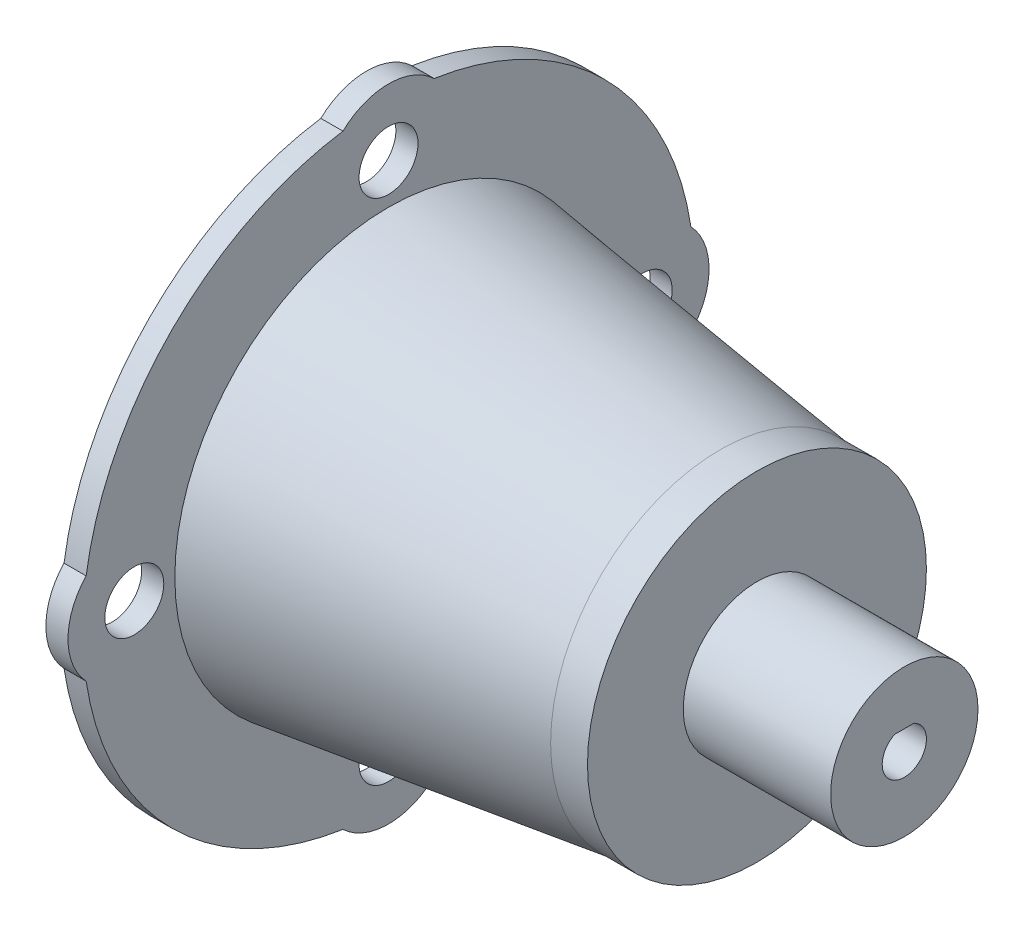
ISO-10303-21;
HEADER;
FILE_DESCRIPTION(('STEP AP214'),'2;1');
FILE_NAME('part.step','',(''),(''),'','','');
FILE_SCHEMA(('AUTOMOTIVE_DESIGN { 1 0 10303 214 1 1 1 1 }'));
ENDSEC;
DATA;
#1=APPLICATION_CONTEXT('core data for automotive mechanical design processes');
#2=APPLICATION_PROTOCOL_DEFINITION('international standard','automotive_design',2000,#1);
#3=PRODUCT_CONTEXT('',#1,'mechanical');
#4=PRODUCT('Part','Part','',(#3));
#5=PRODUCT_RELATED_PRODUCT_CATEGORY('part','',(#4));
#6=PRODUCT_DEFINITION_FORMATION('','',#4);
#7=PRODUCT_DEFINITION_CONTEXT('part definition',#1,'design');
#8=PRODUCT_DEFINITION('design','',#6,#7);
#9=PRODUCT_DEFINITION_SHAPE('','',#8);
#10=(LENGTH_UNIT() NAMED_UNIT(*) SI_UNIT(.MILLI.,.METRE.));
#11=(NAMED_UNIT(*) PLANE_ANGLE_UNIT() SI_UNIT($,.RADIAN.));
#12=(NAMED_UNIT(*) SI_UNIT($,.STERADIAN.) SOLID_ANGLE_UNIT());
#13=UNCERTAINTY_MEASURE_WITH_UNIT(LENGTH_MEASURE(1.E-05),#10,'distance_accuracy_value','');
#14=(GEOMETRIC_REPRESENTATION_CONTEXT(3) GLOBAL_UNCERTAINTY_ASSIGNED_CONTEXT((#13)) GLOBAL_UNIT_ASSIGNED_CONTEXT((#10,
#11,#12)) REPRESENTATION_CONTEXT('',''));
#15=CARTESIAN_POINT('',(0.,0.,0.));
#16=DIRECTION('',(0.,0.,1.));
#17=DIRECTION('',(1.,0.,0.));
#18=AXIS2_PLACEMENT_3D('',#15,#16,#17);
#19=CARTESIAN_POINT('',(3.,0.,0.));
#20=DIRECTION('',(1.,0.,0.));
#21=DIRECTION('',(0.,0.,-1.));
#22=AXIS2_PLACEMENT_3D('',#19,#20,#21);
#23=PLANE('',#22);
#24=CARTESIAN_POINT('',(3.,0.,0.));
#25=DIRECTION('',(1.,0.,0.));
#26=DIRECTION('',(0.,0.,-1.));
#27=AXIS2_PLACEMENT_3D('',#24,#25,#26);
#28=CIRCLE('',#27,29.);
#29=CARTESIAN_POINT('',(3.,0.,-29.));
#30=VERTEX_POINT('',#29);
#31=EDGE_CURVE('E46',#30,#30,#28,.T.);
#32=ORIENTED_EDGE('',*,*,#31,.F.);
#33=EDGE_LOOP('',(#32));
#34=FACE_BOUND('',#33,.T.);
#35=CARTESIAN_POINT('',(3.,34.5,0.));
#36=DIRECTION('',(1.,0.,0.));
#37=DIRECTION('',(0.,0.,-1.));
#38=AXIS2_PLACEMENT_3D('',#35,#36,#37);
#39=CIRCLE('',#38,4.);
#40=CARTESIAN_POINT('',(3.,34.5,-4.));
#41=VERTEX_POINT('',#40);
#42=EDGE_CURVE('E159',#41,#41,#39,.T.);
#43=ORIENTED_EDGE('',*,*,#42,.F.);
#44=EDGE_LOOP('',(#43));
#45=FACE_BOUND('',#44,.T.);
#46=CARTESIAN_POINT('',(3.,-9.80548975348938E-13,34.499999999999));
#47=DIRECTION('',(1.,0.,0.));
#48=DIRECTION('',(0.,0.,-1.));
#49=AXIS2_PLACEMENT_3D('',#46,#47,#48);
#50=CIRCLE('',#49,4.00000000000157);
#51=CARTESIAN_POINT('',(3.,-9.80548975348938E-13,30.4999999999975));
#52=VERTEX_POINT('',#51);
#53=EDGE_CURVE('E156',#52,#52,#50,.T.);
#54=ORIENTED_EDGE('',*,*,#53,.F.);
#55=EDGE_LOOP('',(#54));
#56=FACE_BOUND('',#55,.T.);
#57=CARTESIAN_POINT('',(3.,9.7632394389188E-13,-34.500000000001));
#58=DIRECTION('',(1.,0.,0.));
#59=DIRECTION('',(0.,0.,-1.));
#60=AXIS2_PLACEMENT_3D('',#57,#58,#59);
#61=CIRCLE('',#60,4.00000000000076);
#62=CARTESIAN_POINT('',(3.,9.7632394389188E-13,-38.5000000000017));
#63=VERTEX_POINT('',#62);
#64=EDGE_CURVE('E153',#63,#63,#61,.T.);
#65=ORIENTED_EDGE('',*,*,#64,.F.);
#66=EDGE_LOOP('',(#65));
#67=FACE_BOUND('',#66,.T.);
#68=CARTESIAN_POINT('',(3.,-34.5,-1.95264788778376E-12));
#69=DIRECTION('',(1.,0.,0.));
#70=DIRECTION('',(0.,0.,-1.));
#71=AXIS2_PLACEMENT_3D('',#68,#69,#70);
#72=CIRCLE('',#71,4.0000000000021);
#73=CARTESIAN_POINT('',(3.,-34.5,-4.00000000000405));
#74=VERTEX_POINT('',#73);
#75=EDGE_CURVE('E147',#74,#74,#72,.T.);
#76=ORIENTED_EDGE('',*,*,#75,.F.);
#77=EDGE_LOOP('',(#76));
#78=FACE_BOUND('',#77,.T.);
#79=CARTESIAN_POINT('',(3.,0.,0.));
#80=DIRECTION('',(1.,0.,0.));
#81=DIRECTION('',(0.,0.,-1.));
#82=AXIS2_PLACEMENT_3D('',#79,#80,#81);
#83=CIRCLE('',#82,41.5);
#84=CARTESIAN_POINT('',(3.,41.036231884058,6.18689524380557));
#85=VERTEX_POINT('',#84);
#86=CARTESIAN_POINT('',(3.,6.1868952438032,41.0362318840583));
#87=VERTEX_POINT('',#86);
#88=EDGE_CURVE('E194',#85,#87,#83,.T.);
#89=ORIENTED_EDGE('',*,*,#88,.T.);
#90=CARTESIAN_POINT('',(3.,-9.80548975348938E-13,34.499999999999));
#91=DIRECTION('',(1.,0.,0.));
#92=DIRECTION('',(0.,0.,-1.));
#93=AXIS2_PLACEMENT_3D('',#90,#91,#92);
#94=CIRCLE('',#93,9.);
#95=CARTESIAN_POINT('',(3.,-6.18689524380553,41.036231884058));
#96=VERTEX_POINT('',#95);
#97=EDGE_CURVE('E109',#87,#96,#94,.T.);
#98=ORIENTED_EDGE('',*,*,#97,.T.);
#99=CARTESIAN_POINT('',(3.,0.,0.));
#100=DIRECTION('',(1.,0.,0.));
#101=DIRECTION('',(0.,0.,-1.));
#102=AXIS2_PLACEMENT_3D('',#99,#100,#101);
#103=CIRCLE('',#102,41.5);
#104=CARTESIAN_POINT('',(3.,-41.0362318840583,6.18689524380327));
#105=VERTEX_POINT('',#104);
#106=EDGE_CURVE('E296',#96,#105,#103,.T.);
#107=ORIENTED_EDGE('',*,*,#106,.T.);
#108=CARTESIAN_POINT('',(3.,-34.5,-1.95264788778376E-12));
#109=DIRECTION('',(1.,0.,0.));
#110=DIRECTION('',(0.,0.,-1.));
#111=AXIS2_PLACEMENT_3D('',#108,#109,#110);
#112=CIRCLE('',#111,9.);
#113=CARTESIAN_POINT('',(3.,-41.0362318840576,-6.18689524380791));
#114=VERTEX_POINT('',#113);
#115=EDGE_CURVE('E301',#105,#114,#112,.T.);
#116=ORIENTED_EDGE('',*,*,#115,.T.);
#117=CARTESIAN_POINT('',(3.,0.,0.));
#118=DIRECTION('',(1.,0.,0.));
#119=DIRECTION('',(0.,0.,-1.));
#120=AXIS2_PLACEMENT_3D('',#117,#118,#119);
#121=CIRCLE('',#120,41.5);
#122=CARTESIAN_POINT('',(3.,-6.18689524380565,-41.036231884058));
#123=VERTEX_POINT('',#122);
#124=EDGE_CURVE('E130',#114,#123,#121,.T.);
#125=ORIENTED_EDGE('',*,*,#124,.T.);
#126=CARTESIAN_POINT('',(3.,9.7632394389188E-13,-34.500000000001));
#127=DIRECTION('',(1.,0.,0.));
#128=DIRECTION('',(0.,0.,-1.));
#129=AXIS2_PLACEMENT_3D('',#126,#127,#128);
#130=CIRCLE('',#129,9.);
#131=CARTESIAN_POINT('',(3.,6.18689524380797,-41.0362318840576));
#132=VERTEX_POINT('',#131);
#133=EDGE_CURVE('E124',#123,#132,#130,.T.);
#134=ORIENTED_EDGE('',*,*,#133,.T.);
#135=CARTESIAN_POINT('',(3.,0.,0.));
#136=DIRECTION('',(1.,0.,0.));
#137=DIRECTION('',(0.,0.,-1.));
#138=AXIS2_PLACEMENT_3D('',#135,#136,#137);
#139=CIRCLE('',#138,41.5);
#140=CARTESIAN_POINT('',(3.,41.036231884058,-6.18689524380557));
#141=VERTEX_POINT('',#140);
#142=EDGE_CURVE('E127',#132,#141,#139,.T.);
#143=ORIENTED_EDGE('',*,*,#142,.T.);
#144=CARTESIAN_POINT('',(3.,34.5,0.));
#145=DIRECTION('',(1.,0.,0.));
#146=DIRECTION('',(0.,0.,-1.));
#147=AXIS2_PLACEMENT_3D('',#144,#145,#146);
#148=CIRCLE('',#147,9.);
#149=EDGE_CURVE('E67',#141,#85,#148,.T.);
#150=ORIENTED_EDGE('',*,*,#149,.T.);
#151=EDGE_LOOP('',(#89,#98,#107,#116,#125,#134,#143,#150));
#152=FACE_BOUND('',#151,.T.);
#153=ADVANCED_FACE('F42',(#34,#45,#56,#67,#78,#152),#23,.T.);
#154=CARTESIAN_POINT('',(3.,0.,0.));
#155=DIRECTION('',(-1.,0.,0.));
#156=DIRECTION('',(0.,0.,1.));
#157=AXIS2_PLACEMENT_3D('',#154,#155,#156);
#158=CYLINDRICAL_SURFACE('',#157,41.5);
#159=CARTESIAN_POINT('',(0.,0.,0.));
#160=DIRECTION('',(1.,0.,0.));
#161=DIRECTION('',(0.,0.,-1.));
#162=AXIS2_PLACEMENT_3D('',#159,#160,#161);
#163=CIRCLE('',#162,41.5);
#164=CARTESIAN_POINT('',(0.,41.036231884058,6.18689524380557));
#165=VERTEX_POINT('',#164);
#166=CARTESIAN_POINT('',(0.,6.1868952438032,41.0362318840583));
#167=VERTEX_POINT('',#166);
#168=EDGE_CURVE('E163',#165,#167,#163,.T.);
#169=ORIENTED_EDGE('',*,*,#168,.T.);
#170=DIRECTION('',(-1.,0.,0.));
#171=VECTOR('',#170,1.);
#172=CARTESIAN_POINT('',(3.,6.1868952438032,41.0362318840583));
#173=LINE('',#172,#171);
#174=EDGE_CURVE('E207',#87,#167,#173,.T.);
#175=ORIENTED_EDGE('',*,*,#174,.F.);
#176=ORIENTED_EDGE('',*,*,#88,.F.);
#177=DIRECTION('',(-1.,0.,0.));
#178=VECTOR('',#177,1.);
#179=CARTESIAN_POINT('',(3.,41.036231884058,6.18689524380557));
#180=LINE('',#179,#178);
#181=EDGE_CURVE('E162',#85,#165,#180,.T.);
#182=ORIENTED_EDGE('',*,*,#181,.T.);
#183=EDGE_LOOP('',(#169,#175,#176,#182));
#184=FACE_BOUND('',#183,.T.);
#185=ADVANCED_FACE('F44',(#184),#158,.T.);
#186=CARTESIAN_POINT('',(3.,-9.80548975348938E-13,34.499999999999));
#187=DIRECTION('',(-1.,0.,0.));
#188=DIRECTION('',(0.,0.,1.));
#189=AXIS2_PLACEMENT_3D('',#186,#187,#188);
#190=CYLINDRICAL_SURFACE('',#189,9.);
#191=CARTESIAN_POINT('',(0.,-9.80548975348938E-13,34.499999999999));
#192=DIRECTION('',(1.,0.,0.));
#193=DIRECTION('',(0.,0.,-1.));
#194=AXIS2_PLACEMENT_3D('',#191,#192,#193);
#195=CIRCLE('',#194,9.);
#196=CARTESIAN_POINT('',(0.,-6.18689524380553,41.036231884058));
#197=VERTEX_POINT('',#196);
#198=EDGE_CURVE('E166',#167,#197,#195,.T.);
#199=ORIENTED_EDGE('',*,*,#198,.T.);
#200=DIRECTION('',(-1.,0.,0.));
#201=VECTOR('',#200,1.);
#202=CARTESIAN_POINT('',(3.,-6.18689524380553,41.036231884058));
#203=LINE('',#202,#201);
#204=EDGE_CURVE('E204',#96,#197,#203,.T.);
#205=ORIENTED_EDGE('',*,*,#204,.F.);
#206=ORIENTED_EDGE('',*,*,#97,.F.);
#207=ORIENTED_EDGE('',*,*,#174,.T.);
#208=EDGE_LOOP('',(#199,#205,#206,#207));
#209=FACE_BOUND('',#208,.T.);
#210=ADVANCED_FACE('F284',(#209),#190,.T.);
#211=CARTESIAN_POINT('',(3.,0.,0.));
#212=DIRECTION('',(-1.,0.,0.));
#213=DIRECTION('',(0.,0.,1.));
#214=AXIS2_PLACEMENT_3D('',#211,#212,#213);
#215=CYLINDRICAL_SURFACE('',#214,41.5);
#216=CARTESIAN_POINT('',(0.,0.,0.));
#217=DIRECTION('',(1.,0.,0.));
#218=DIRECTION('',(0.,0.,-1.));
#219=AXIS2_PLACEMENT_3D('',#216,#217,#218);
#220=CIRCLE('',#219,41.5);
#221=CARTESIAN_POINT('',(0.,-41.0362318840583,6.18689524380327));
#222=VERTEX_POINT('',#221);
#223=EDGE_CURVE('E169',#197,#222,#220,.T.);
#224=ORIENTED_EDGE('',*,*,#223,.T.);
#225=DIRECTION('',(-1.,0.,0.));
#226=VECTOR('',#225,1.);
#227=CARTESIAN_POINT('',(3.,-41.0362318840583,6.18689524380327));
#228=LINE('',#227,#226);
#229=EDGE_CURVE('E201',#105,#222,#228,.T.);
#230=ORIENTED_EDGE('',*,*,#229,.F.);
#231=ORIENTED_EDGE('',*,*,#106,.F.);
#232=ORIENTED_EDGE('',*,*,#204,.T.);
#233=EDGE_LOOP('',(#224,#230,#231,#232));
#234=FACE_BOUND('',#233,.T.);
#235=ADVANCED_FACE('F281',(#234),#215,.T.);
#236=CARTESIAN_POINT('',(3.,-34.5,-1.95264788778376E-12));
#237=DIRECTION('',(-1.,0.,0.));
#238=DIRECTION('',(0.,0.,1.));
#239=AXIS2_PLACEMENT_3D('',#236,#237,#238);
#240=CYLINDRICAL_SURFACE('',#239,9.);
#241=CARTESIAN_POINT('',(0.,-34.5,-1.95264788778376E-12));
#242=DIRECTION('',(1.,0.,0.));
#243=DIRECTION('',(0.,0.,-1.));
#244=AXIS2_PLACEMENT_3D('',#241,#242,#243);
#245=CIRCLE('',#244,9.);
#246=CARTESIAN_POINT('',(0.,-41.0362318840576,-6.18689524380791));
#247=VERTEX_POINT('',#246);
#248=EDGE_CURVE('E171',#222,#247,#245,.T.);
#249=ORIENTED_EDGE('',*,*,#248,.T.);
#250=DIRECTION('',(-1.,0.,0.));
#251=VECTOR('',#250,1.);
#252=CARTESIAN_POINT('',(3.,-41.0362318840576,-6.18689524380791));
#253=LINE('',#252,#251);
#254=EDGE_CURVE('E198',#114,#247,#253,.T.);
#255=ORIENTED_EDGE('',*,*,#254,.F.);
#256=ORIENTED_EDGE('',*,*,#115,.F.);
#257=ORIENTED_EDGE('',*,*,#229,.T.);
#258=EDGE_LOOP('',(#249,#255,#256,#257));
#259=FACE_BOUND('',#258,.T.);
#260=ADVANCED_FACE('F277',(#259),#240,.T.);
#261=CARTESIAN_POINT('',(3.,0.,0.));
#262=DIRECTION('',(-1.,0.,0.));
#263=DIRECTION('',(0.,0.,1.));
#264=AXIS2_PLACEMENT_3D('',#261,#262,#263);
#265=CYLINDRICAL_SURFACE('',#264,41.5);
#266=CARTESIAN_POINT('',(0.,0.,0.));
#267=DIRECTION('',(1.,0.,0.));
#268=DIRECTION('',(0.,0.,-1.));
#269=AXIS2_PLACEMENT_3D('',#266,#267,#268);
#270=CIRCLE('',#269,41.5);
#271=CARTESIAN_POINT('',(0.,-6.18689524380565,-41.036231884058));
#272=VERTEX_POINT('',#271);
#273=EDGE_CURVE('E173',#247,#272,#270,.T.);
#274=ORIENTED_EDGE('',*,*,#273,.T.);
#275=DIRECTION('',(-1.,0.,0.));
#276=VECTOR('',#275,1.);
#277=CARTESIAN_POINT('',(3.,-6.18689524380565,-41.036231884058));
#278=LINE('',#277,#276);
#279=EDGE_CURVE('E142',#123,#272,#278,.T.);
#280=ORIENTED_EDGE('',*,*,#279,.F.);
#281=ORIENTED_EDGE('',*,*,#124,.F.);
#282=ORIENTED_EDGE('',*,*,#254,.T.);
#283=EDGE_LOOP('',(#274,#280,#281,#282));
#284=FACE_BOUND('',#283,.T.);
#285=ADVANCED_FACE('F274',(#284),#265,.T.);
#286=CARTESIAN_POINT('',(3.,9.7632394389188E-13,-34.500000000001));
#287=DIRECTION('',(-1.,0.,0.));
#288=DIRECTION('',(0.,0.,1.));
#289=AXIS2_PLACEMENT_3D('',#286,#287,#288);
#290=CYLINDRICAL_SURFACE('',#289,9.);
#291=CARTESIAN_POINT('',(0.,9.7632394389188E-13,-34.500000000001));
#292=DIRECTION('',(1.,0.,0.));
#293=DIRECTION('',(0.,0.,-1.));
#294=AXIS2_PLACEMENT_3D('',#291,#292,#293);
#295=CIRCLE('',#294,9.);
#296=CARTESIAN_POINT('',(0.,6.18689524380797,-41.0362318840576));
#297=VERTEX_POINT('',#296);
#298=EDGE_CURVE('E139',#272,#297,#295,.T.);
#299=ORIENTED_EDGE('',*,*,#298,.T.);
#300=DIRECTION('',(-1.,0.,0.));
#301=VECTOR('',#300,1.);
#302=CARTESIAN_POINT('',(3.,6.18689524380797,-41.0362318840576));
#303=LINE('',#302,#301);
#304=EDGE_CURVE('E136',#132,#297,#303,.T.);
#305=ORIENTED_EDGE('',*,*,#304,.F.);
#306=ORIENTED_EDGE('',*,*,#133,.F.);
#307=ORIENTED_EDGE('',*,*,#279,.T.);
#308=EDGE_LOOP('',(#299,#305,#306,#307));
#309=FACE_BOUND('',#308,.T.);
#310=ADVANCED_FACE('F137',(#309),#290,.T.);
#311=CARTESIAN_POINT('',(3.,0.,0.));
#312=DIRECTION('',(-1.,0.,0.));
#313=DIRECTION('',(0.,0.,1.));
#314=AXIS2_PLACEMENT_3D('',#311,#312,#313);
#315=CYLINDRICAL_SURFACE('',#314,41.5);
#316=CARTESIAN_POINT('',(0.,0.,0.));
#317=DIRECTION('',(1.,0.,0.));
#318=DIRECTION('',(0.,0.,-1.));
#319=AXIS2_PLACEMENT_3D('',#316,#317,#318);
#320=CIRCLE('',#319,41.5);
#321=CARTESIAN_POINT('',(0.,41.036231884058,-6.18689524380557));
#322=VERTEX_POINT('',#321);
#323=EDGE_CURVE('E176',#297,#322,#320,.T.);
#324=ORIENTED_EDGE('',*,*,#323,.T.);
#325=DIRECTION('',(-1.,0.,0.));
#326=VECTOR('',#325,1.);
#327=CARTESIAN_POINT('',(3.,41.036231884058,-6.18689524380557));
#328=LINE('',#327,#326);
#329=EDGE_CURVE('E143',#141,#322,#328,.T.);
#330=ORIENTED_EDGE('',*,*,#329,.F.);
#331=ORIENTED_EDGE('',*,*,#142,.F.);
#332=ORIENTED_EDGE('',*,*,#304,.T.);
#333=EDGE_LOOP('',(#324,#330,#331,#332));
#334=FACE_BOUND('',#333,.T.);
#335=ADVANCED_FACE('F145',(#334),#315,.T.);
#336=CARTESIAN_POINT('',(3.,-9.80548975348938E-13,34.499999999999));
#337=DIRECTION('',(-1.,0.,0.));
#338=DIRECTION('',(0.,0.,1.));
#339=AXIS2_PLACEMENT_3D('',#336,#337,#338);
#340=CYLINDRICAL_SURFACE('',#339,4.00000000000157);
#341=ORIENTED_EDGE('',*,*,#53,.T.);
#342=EDGE_LOOP('',(#341));
#343=FACE_BOUND('',#342,.T.);
#344=CARTESIAN_POINT('',(0.,-9.80548975348938E-13,34.499999999999));
#345=DIRECTION('',(1.,0.,0.));
#346=DIRECTION('',(0.,0.,-1.));
#347=AXIS2_PLACEMENT_3D('',#344,#345,#346);
#348=CIRCLE('',#347,4.00000000000157);
#349=CARTESIAN_POINT('',(0.,-9.80548975348938E-13,30.4999999999975));
#350=VERTEX_POINT('',#349);
#351=EDGE_CURVE('E188',#350,#350,#348,.T.);
#352=ORIENTED_EDGE('',*,*,#351,.F.);
#353=EDGE_LOOP('',(#352));
#354=FACE_BOUND('',#353,.T.);
#355=ADVANCED_FACE('F259',(#343,#354),#340,.F.);
#356=CARTESIAN_POINT('',(3.,0.,0.));
#357=DIRECTION('',(-1.,0.,0.));
#358=DIRECTION('',(0.,0.,1.));
#359=AXIS2_PLACEMENT_3D('',#356,#357,#358);
#360=CYLINDRICAL_SURFACE('',#359,20.);
#361=CARTESIAN_POINT('',(0.,0.,0.));
#362=DIRECTION('',(1.,0.,0.));
#363=DIRECTION('',(0.,0.,-1.));
#364=AXIS2_PLACEMENT_3D('',#361,#362,#363);
#365=CIRCLE('',#364,20.);
#366=CARTESIAN_POINT('',(0.,0.,-20.));
#367=VERTEX_POINT('',#366);
#368=EDGE_CURVE('E185',#367,#367,#365,.T.);
#369=ORIENTED_EDGE('',*,*,#368,.F.);
#370=EDGE_LOOP('',(#369));
#371=FACE_BOUND('',#370,.T.);
#372=CARTESIAN_POINT('',(33.,0.,0.));
#373=DIRECTION('',(1.,0.,0.));
#374=DIRECTION('',(0.,0.,-1.));
#375=AXIS2_PLACEMENT_3D('',#372,#373,#374);
#376=CIRCLE('',#375,20.);
#377=CARTESIAN_POINT('',(33.,0.,-20.));
#378=VERTEX_POINT('',#377);
#379=EDGE_CURVE('E167',#378,#378,#376,.T.);
#380=ORIENTED_EDGE('',*,*,#379,.T.);
#381=EDGE_LOOP('',(#380));
#382=FACE_BOUND('',#381,.T.);
#383=ADVANCED_FACE('F262',(#371,#382),#360,.F.);
#384=CARTESIAN_POINT('',(3.,9.7632394389188E-13,-34.500000000001));
#385=DIRECTION('',(-1.,0.,0.));
#386=DIRECTION('',(0.,0.,1.));
#387=AXIS2_PLACEMENT_3D('',#384,#385,#386);
#388=CYLINDRICAL_SURFACE('',#387,4.00000000000076);
#389=ORIENTED_EDGE('',*,*,#64,.T.);
#390=EDGE_LOOP('',(#389));
#391=FACE_BOUND('',#390,.T.);
#392=CARTESIAN_POINT('',(0.,9.7632394389188E-13,-34.500000000001));
#393=DIRECTION('',(1.,0.,0.));
#394=DIRECTION('',(0.,0.,-1.));
#395=AXIS2_PLACEMENT_3D('',#392,#393,#394);
#396=CIRCLE('',#395,4.00000000000076);
#397=CARTESIAN_POINT('',(0.,9.7632394389188E-13,-38.5000000000017));
#398=VERTEX_POINT('',#397);
#399=EDGE_CURVE('E182',#398,#398,#396,.T.);
#400=ORIENTED_EDGE('',*,*,#399,.F.);
#401=EDGE_LOOP('',(#400));
#402=FACE_BOUND('',#401,.T.);
#403=ADVANCED_FACE('F232',(#391,#402),#388,.F.);
#404=CARTESIAN_POINT('',(3.,-34.5,-1.95264788778376E-12));
#405=DIRECTION('',(-1.,0.,0.));
#406=DIRECTION('',(0.,0.,1.));
#407=AXIS2_PLACEMENT_3D('',#404,#405,#406);
#408=CYLINDRICAL_SURFACE('',#407,4.0000000000021);
#409=ORIENTED_EDGE('',*,*,#75,.T.);
#410=EDGE_LOOP('',(#409));
#411=FACE_BOUND('',#410,.T.);
#412=CARTESIAN_POINT('',(0.,-34.5,-1.95264788778376E-12));
#413=DIRECTION('',(1.,0.,0.));
#414=DIRECTION('',(0.,0.,-1.));
#415=AXIS2_PLACEMENT_3D('',#412,#413,#414);
#416=CIRCLE('',#415,4.0000000000021);
#417=CARTESIAN_POINT('',(0.,-34.5,-4.00000000000405));
#418=VERTEX_POINT('',#417);
#419=EDGE_CURVE('E179',#418,#418,#416,.T.);
#420=ORIENTED_EDGE('',*,*,#419,.F.);
#421=EDGE_LOOP('',(#420));
#422=FACE_BOUND('',#421,.T.);
#423=ADVANCED_FACE('F228',(#411,#422),#408,.F.);
#424=CARTESIAN_POINT('',(3.,34.5,0.));
#425=DIRECTION('',(-1.,0.,0.));
#426=DIRECTION('',(0.,0.,1.));
#427=AXIS2_PLACEMENT_3D('',#424,#425,#426);
#428=CYLINDRICAL_SURFACE('',#427,9.);
#429=CARTESIAN_POINT('',(0.,34.5,0.));
#430=DIRECTION('',(1.,0.,0.));
#431=DIRECTION('',(0.,0.,-1.));
#432=AXIS2_PLACEMENT_3D('',#429,#430,#431);
#433=CIRCLE('',#432,9.);
#434=EDGE_CURVE('E100',#322,#165,#433,.T.);
#435=ORIENTED_EDGE('',*,*,#434,.T.);
#436=ORIENTED_EDGE('',*,*,#181,.F.);
#437=ORIENTED_EDGE('',*,*,#149,.F.);
#438=ORIENTED_EDGE('',*,*,#329,.T.);
#439=EDGE_LOOP('',(#435,#436,#437,#438));
#440=FACE_BOUND('',#439,.T.);
#441=ADVANCED_FACE('F231',(#440),#428,.T.);
#442=CARTESIAN_POINT('',(3.,34.5,0.));
#443=DIRECTION('',(-1.,0.,0.));
#444=DIRECTION('',(0.,0.,1.));
#445=AXIS2_PLACEMENT_3D('',#442,#443,#444);
#446=CYLINDRICAL_SURFACE('',#445,4.);
#447=ORIENTED_EDGE('',*,*,#42,.T.);
#448=EDGE_LOOP('',(#447));
#449=FACE_BOUND('',#448,.T.);
#450=CARTESIAN_POINT('',(0.,34.5,0.));
#451=DIRECTION('',(1.,0.,0.));
#452=DIRECTION('',(0.,0.,-1.));
#453=AXIS2_PLACEMENT_3D('',#450,#451,#452);
#454=CIRCLE('',#453,4.);
#455=CARTESIAN_POINT('',(0.,34.5,-4.));
#456=VERTEX_POINT('',#455);
#457=EDGE_CURVE('E191',#456,#456,#454,.T.);
#458=ORIENTED_EDGE('',*,*,#457,.F.);
#459=EDGE_LOOP('',(#458));
#460=FACE_BOUND('',#459,.T.);
#461=ADVANCED_FACE('F240',(#449,#460),#446,.F.);
#462=CARTESIAN_POINT('',(0.,0.,0.));
#463=DIRECTION('',(1.,0.,0.));
#464=DIRECTION('',(0.,0.,-1.));
#465=AXIS2_PLACEMENT_3D('',#462,#463,#464);
#466=PLANE('',#465);
#467=ORIENTED_EDGE('',*,*,#168,.F.);
#468=ORIENTED_EDGE('',*,*,#434,.F.);
#469=ORIENTED_EDGE('',*,*,#323,.F.);
#470=ORIENTED_EDGE('',*,*,#298,.F.);
#471=ORIENTED_EDGE('',*,*,#273,.F.);
#472=ORIENTED_EDGE('',*,*,#248,.F.);
#473=ORIENTED_EDGE('',*,*,#223,.F.);
#474=ORIENTED_EDGE('',*,*,#198,.F.);
#475=EDGE_LOOP('',(#467,#468,#469,#470,#471,#472,#473,#474));
#476=FACE_BOUND('',#475,.T.);
#477=ORIENTED_EDGE('',*,*,#419,.T.);
#478=EDGE_LOOP('',(#477));
#479=FACE_BOUND('',#478,.T.);
#480=ORIENTED_EDGE('',*,*,#399,.T.);
#481=EDGE_LOOP('',(#480));
#482=FACE_BOUND('',#481,.T.);
#483=ORIENTED_EDGE('',*,*,#368,.T.);
#484=EDGE_LOOP('',(#483));
#485=FACE_BOUND('',#484,.T.);
#486=ORIENTED_EDGE('',*,*,#351,.T.);
#487=EDGE_LOOP('',(#486));
#488=FACE_BOUND('',#487,.T.);
#489=ORIENTED_EDGE('',*,*,#457,.T.);
#490=EDGE_LOOP('',(#489));
#491=FACE_BOUND('',#490,.T.);
#492=ADVANCED_FACE('F236',(#476,#479,#482,#485,#488,#491),#466,.F.);
#493=CARTESIAN_POINT('',(33.,0.,0.));
#494=DIRECTION('',(1.,0.,0.));
#495=DIRECTION('',(0.,0.,-1.));
#496=AXIS2_PLACEMENT_3D('',#493,#494,#495);
#497=PLANE('',#496);
#498=CARTESIAN_POINT('',(33.,0.,0.));
#499=DIRECTION('',(1.,0.,0.));
#500=DIRECTION('',(0.,0.,-1.));
#501=AXIS2_PLACEMENT_3D('',#498,#499,#500);
#502=CIRCLE('',#501,4.4);
#503=CARTESIAN_POINT('',(33.,0.,-4.4));
#504=VERTEX_POINT('',#503);
#505=EDGE_CURVE('E208',#504,#504,#502,.F.);
#506=ORIENTED_EDGE('',*,*,#505,.F.);
#507=EDGE_LOOP('',(#506));
#508=FACE_BOUND('',#507,.T.);
#509=ORIENTED_EDGE('',*,*,#379,.F.);
#510=EDGE_LOOP('',(#509));
#511=FACE_BOUND('',#510,.T.);
#512=ADVANCED_FACE('F239',(#508,#511),#497,.F.);
#513=CARTESIAN_POINT('',(13.,0.,0.));
#514=DIRECTION('',(1.,0.,0.));
#515=DIRECTION('',(0.,0.,-1.));
#516=AXIS2_PLACEMENT_3D('',#513,#514,#515);
#517=CYLINDRICAL_SURFACE('',#516,4.4);
#518=CARTESIAN_POINT('',(13.,0.,0.));
#519=DIRECTION('',(-1.,0.,0.));
#520=DIRECTION('',(0.,0.,1.));
#521=AXIS2_PLACEMENT_3D('',#518,#519,#520);
#522=CIRCLE('',#521,4.4);
#523=CARTESIAN_POINT('',(13.,0.,4.4));
#524=VERTEX_POINT('',#523);
#525=EDGE_CURVE('E312',#524,#524,#522,.T.);
#526=ORIENTED_EDGE('',*,*,#525,.F.);
#527=EDGE_LOOP('',(#526));
#528=FACE_BOUND('',#527,.T.);
#529=ORIENTED_EDGE('',*,*,#505,.T.);
#530=EDGE_LOOP('',(#529));
#531=FACE_BOUND('',#530,.T.);
#532=ADVANCED_FACE('F388',(#528,#531),#517,.T.);
#533=CARTESIAN_POINT('',(13.,0.,0.));
#534=DIRECTION('',(-1.,0.,0.));
#535=DIRECTION('',(0.,0.,1.));
#536=AXIS2_PLACEMENT_3D('',#533,#534,#535);
#537=PLANE('',#536);
#538=ORIENTED_EDGE('',*,*,#525,.T.);
#539=EDGE_LOOP('',(#538));
#540=FACE_BOUND('',#539,.T.);
#541=ADVANCED_FACE('F366',(#540),#537,.T.);
#542=CARTESIAN_POINT('',(3.,0.,0.));
#543=DIRECTION('',(-1.,0.,0.));
#544=DIRECTION('',(0.,0.,1.));
#545=AXIS2_PLACEMENT_3D('',#542,#543,#544);
#546=CONICAL_SURFACE('',#545,29.,0.132551532296674);
#547=CARTESIAN_POINT('',(48.,0.,0.));
#548=DIRECTION('',(-1.,0.,0.));
#549=DIRECTION('',(0.,0.,1.));
#550=AXIS2_PLACEMENT_3D('',#547,#548,#549);
#551=CIRCLE('',#550,23.);
#552=CARTESIAN_POINT('',(48.,0.,23.));
#553=VERTEX_POINT('',#552);
#554=EDGE_CURVE('E315',#553,#553,#551,.T.);
#555=ORIENTED_EDGE('',*,*,#554,.T.);
#556=EDGE_LOOP('',(#555));
#557=FACE_BOUND('',#556,.T.);
#558=ORIENTED_EDGE('',*,*,#31,.T.);
#559=EDGE_LOOP('',(#558));
#560=FACE_BOUND('',#559,.T.);
#561=ADVANCED_FACE('F215',(#557,#560),#546,.T.);
#562=CARTESIAN_POINT('',(53.,0.,0.));
#563=DIRECTION('',(1.,0.,0.));
#564=DIRECTION('',(0.,0.,-1.));
#565=AXIS2_PLACEMENT_3D('',#562,#563,#564);
#566=PLANE('',#565);
#567=CARTESIAN_POINT('',(53.,0.,0.));
#568=DIRECTION('',(1.,0.,0.));
#569=DIRECTION('',(0.,0.,-1.));
#570=AXIS2_PLACEMENT_3D('',#567,#568,#569);
#571=CIRCLE('',#570,10.);
#572=CARTESIAN_POINT('',(53.,0.,-10.));
#573=VERTEX_POINT('',#572);
#574=EDGE_CURVE('E12',#573,#573,#571,.T.);
#575=ORIENTED_EDGE('',*,*,#574,.F.);
#576=EDGE_LOOP('',(#575));
#577=FACE_BOUND('',#576,.T.);
#578=CARTESIAN_POINT('',(53.,0.,0.));
#579=DIRECTION('',(1.,0.,0.));
#580=DIRECTION('',(0.,0.,-1.));
#581=AXIS2_PLACEMENT_3D('',#578,#579,#580);
#582=CIRCLE('',#581,23.);
#583=CARTESIAN_POINT('',(53.,0.,-23.));
#584=VERTEX_POINT('',#583);
#585=EDGE_CURVE('E309',#584,#584,#582,.T.);
#586=ORIENTED_EDGE('',*,*,#585,.T.);
#587=EDGE_LOOP('',(#586));
#588=FACE_BOUND('',#587,.T.);
#589=ADVANCED_FACE('F350',(#577,#588),#566,.T.);
#590=CARTESIAN_POINT('',(33.,0.,0.));
#591=DIRECTION('',(-1.,0.,0.));
#592=DIRECTION('',(0.,0.,1.));
#593=AXIS2_PLACEMENT_3D('',#590,#591,#592);
#594=CYLINDRICAL_SURFACE('',#593,23.);
#595=ORIENTED_EDGE('',*,*,#554,.F.);
#596=EDGE_LOOP('',(#595));
#597=FACE_BOUND('',#596,.T.);
#598=ORIENTED_EDGE('',*,*,#585,.F.);
#599=EDGE_LOOP('',(#598));
#600=FACE_BOUND('',#599,.T.);
#601=ADVANCED_FACE('F358',(#597,#600),#594,.T.);
#602=CARTESIAN_POINT('',(73.,0.,0.));
#603=DIRECTION('',(1.,0.,0.));
#604=DIRECTION('',(0.,0.,-1.));
#605=AXIS2_PLACEMENT_3D('',#602,#603,#604);
#606=PLANE('',#605);
#607=CARTESIAN_POINT('',(73.,0.,0.));
#608=DIRECTION('',(1.,0.,0.));
#609=DIRECTION('',(0.,0.,-1.));
#610=AXIS2_PLACEMENT_3D('',#607,#608,#609);
#611=CIRCLE('',#610,10.);
#612=CARTESIAN_POINT('',(73.,0.,-10.));
#613=VERTEX_POINT('',#612);
#614=EDGE_CURVE('E317',#613,#613,#611,.T.);
#615=ORIENTED_EDGE('',*,*,#614,.T.);
#616=EDGE_LOOP('',(#615));
#617=FACE_BOUND('',#616,.T.);
#618=DIRECTION('',(0.,0.,1.));
#619=VECTOR('',#618,1.);
#620=CARTESIAN_POINT('',(73.,2.7,1.3076696830622));
#621=LINE('',#620,#619);
#622=CARTESIAN_POINT('',(73.,2.7,-1.3076696830622));
#623=VERTEX_POINT('',#622);
#624=CARTESIAN_POINT('',(73.,2.7,1.3076696830622));
#625=VERTEX_POINT('',#624);
#626=EDGE_CURVE('E325',#623,#625,#621,.T.);
#627=ORIENTED_EDGE('',*,*,#626,.F.);
#628=CARTESIAN_POINT('',(73.,0.,0.));
#629=DIRECTION('',(1.,0.,0.));
#630=DIRECTION('',(0.,0.,-1.));
#631=AXIS2_PLACEMENT_3D('',#628,#629,#630);
#632=CIRCLE('',#631,3.);
#633=EDGE_CURVE('E329',#625,#623,#632,.T.);
#634=ORIENTED_EDGE('',*,*,#633,.F.);
#635=EDGE_LOOP('',(#627,#634));
#636=FACE_BOUND('',#635,.T.);
#637=ADVANCED_FACE('F343',(#617,#636),#606,.T.);
#638=CARTESIAN_POINT('',(73.,0.,0.));
#639=DIRECTION('',(-1.,0.,0.));
#640=DIRECTION('',(0.,0.,1.));
#641=AXIS2_PLACEMENT_3D('',#638,#639,#640);
#642=CYLINDRICAL_SURFACE('',#641,10.);
#643=ORIENTED_EDGE('',*,*,#614,.F.);
#644=EDGE_LOOP('',(#643));
#645=FACE_BOUND('',#644,.T.);
#646=ORIENTED_EDGE('',*,*,#574,.T.);
#647=EDGE_LOOP('',(#646));
#648=FACE_BOUND('',#647,.T.);
#649=ADVANCED_FACE('F374',(#645,#648),#642,.T.);
#650=CARTESIAN_POINT('',(73.,0.,0.));
#651=DIRECTION('',(-1.,0.,0.));
#652=DIRECTION('',(0.,0.,1.));
#653=AXIS2_PLACEMENT_3D('',#650,#651,#652);
#654=CYLINDRICAL_SURFACE('',#653,3.);
#655=CARTESIAN_POINT('',(53.,0.,0.));
#656=DIRECTION('',(1.,0.,0.));
#657=DIRECTION('',(0.,0.,-1.));
#658=AXIS2_PLACEMENT_3D('',#655,#656,#657);
#659=CIRCLE('',#658,3.);
#660=CARTESIAN_POINT('',(53.,2.7,1.3076696830622));
#661=VERTEX_POINT('',#660);
#662=CARTESIAN_POINT('',(53.,2.7,-1.3076696830622));
#663=VERTEX_POINT('',#662);
#664=EDGE_CURVE('E330',#661,#663,#659,.T.);
#665=ORIENTED_EDGE('',*,*,#664,.F.);
#666=DIRECTION('',(-1.,0.,0.));
#667=VECTOR('',#666,1.);
#668=CARTESIAN_POINT('',(73.,2.7,1.3076696830622));
#669=LINE('',#668,#667);
#670=EDGE_CURVE('E58',#625,#661,#669,.T.);
#671=ORIENTED_EDGE('',*,*,#670,.F.);
#672=ORIENTED_EDGE('',*,*,#633,.T.);
#673=DIRECTION('',(-1.,0.,0.));
#674=VECTOR('',#673,1.);
#675=CARTESIAN_POINT('',(73.,2.7,-1.3076696830622));
#676=LINE('',#675,#674);
#677=EDGE_CURVE('E321',#623,#663,#676,.T.);
#678=ORIENTED_EDGE('',*,*,#677,.T.);
#679=EDGE_LOOP('',(#665,#671,#672,#678));
#680=FACE_BOUND('',#679,.T.);
#681=ADVANCED_FACE('F338',(#680),#654,.F.);
#682=CARTESIAN_POINT('',(73.,2.7,1.3076696830622));
#683=DIRECTION('',(0.,-1.,0.));
#684=DIRECTION('',(0.,0.,-1.));
#685=AXIS2_PLACEMENT_3D('',#682,#683,#684);
#686=PLANE('',#685);
#687=DIRECTION('',(0.,0.,1.));
#688=VECTOR('',#687,1.);
#689=CARTESIAN_POINT('',(53.,2.7,1.3076696830622));
#690=LINE('',#689,#688);
#691=EDGE_CURVE('E326',#663,#661,#690,.T.);
#692=ORIENTED_EDGE('',*,*,#691,.F.);
#693=ORIENTED_EDGE('',*,*,#677,.F.);
#694=ORIENTED_EDGE('',*,*,#626,.T.);
#695=ORIENTED_EDGE('',*,*,#670,.T.);
#696=EDGE_LOOP('',(#692,#693,#694,#695));
#697=FACE_BOUND('',#696,.T.);
#698=ADVANCED_FACE('F344',(#697),#686,.T.);
#699=ORIENTED_EDGE('',*,*,#691,.T.);
#700=ORIENTED_EDGE('',*,*,#664,.T.);
#701=EDGE_LOOP('',(#699,#700));
#702=FACE_BOUND('',#701,.T.);
#703=ADVANCED_FACE('F347',(#702),#566,.T.);
#704=CLOSED_SHELL('',(#153,#185,#210,#235,#260,#285,#310,#335,#355,#383,#403,#423,#441,#461,
#492,#512,#532,#541,#561,#589,#601,#637,#649,#681,#698,#703));
#705=MANIFOLD_SOLID_BREP('B2',#704);
#706=ADVANCED_BREP_SHAPE_REPRESENTATION('',(#18,#705),#14);
#707=SHAPE_DEFINITION_REPRESENTATION(#9,#706);
ENDSEC;
END-ISO-10303-21;
